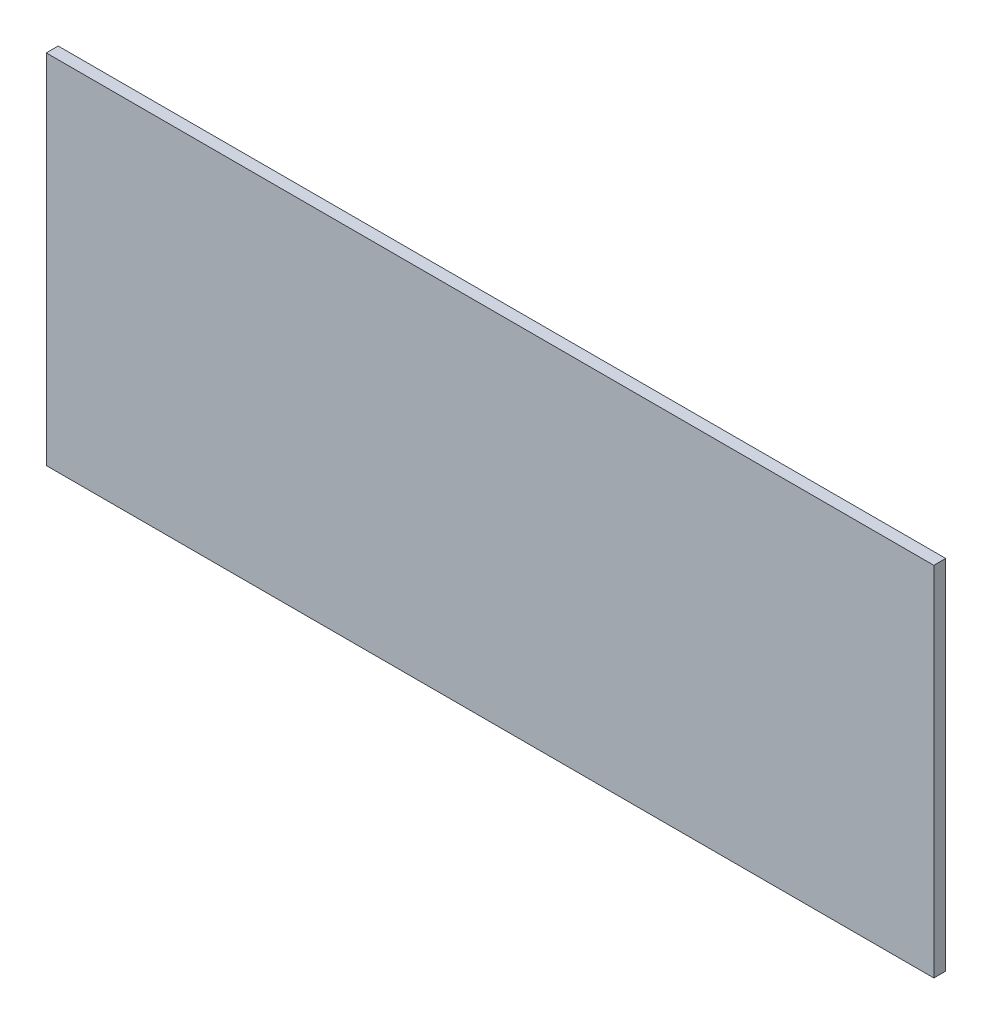
ISO-10303-21;
HEADER;
FILE_DESCRIPTION(('STEP AP214'),'2;1');
FILE_NAME('part.step','',(''),(''),'','','');
FILE_SCHEMA(('AUTOMOTIVE_DESIGN { 1 0 10303 214 1 1 1 1 }'));
ENDSEC;
DATA;
#1=APPLICATION_CONTEXT('core data for automotive mechanical design processes');
#2=APPLICATION_PROTOCOL_DEFINITION('international standard','automotive_design',2000,#1);
#3=PRODUCT_CONTEXT('',#1,'mechanical');
#4=PRODUCT('Part','Part','',(#3));
#5=PRODUCT_RELATED_PRODUCT_CATEGORY('part','',(#4));
#6=PRODUCT_DEFINITION_FORMATION('','',#4);
#7=PRODUCT_DEFINITION_CONTEXT('part definition',#1,'design');
#8=PRODUCT_DEFINITION('design','',#6,#7);
#9=PRODUCT_DEFINITION_SHAPE('','',#8);
#10=(LENGTH_UNIT() NAMED_UNIT(*) SI_UNIT(.MILLI.,.METRE.));
#11=(NAMED_UNIT(*) PLANE_ANGLE_UNIT() SI_UNIT($,.RADIAN.));
#12=(NAMED_UNIT(*) SI_UNIT($,.STERADIAN.) SOLID_ANGLE_UNIT());
#13=UNCERTAINTY_MEASURE_WITH_UNIT(LENGTH_MEASURE(1.E-05),#10,'distance_accuracy_value','');
#14=(GEOMETRIC_REPRESENTATION_CONTEXT(3) GLOBAL_UNCERTAINTY_ASSIGNED_CONTEXT((#13)) GLOBAL_UNIT_ASSIGNED_CONTEXT((#10,
#11,#12)) REPRESENTATION_CONTEXT('',''));
#15=CARTESIAN_POINT('',(0.,0.,0.));
#16=DIRECTION('',(0.,0.,1.));
#17=DIRECTION('',(1.,0.,0.));
#18=AXIS2_PLACEMENT_3D('',#15,#16,#17);
#19=CARTESIAN_POINT('',(74.5,-30.,2.));
#20=DIRECTION('',(-1.,0.,0.));
#21=DIRECTION('',(0.,0.,1.));
#22=AXIS2_PLACEMENT_3D('',#19,#20,#21);
#23=PLANE('',#22);
#24=DIRECTION('',(0.,1.,0.));
#25=VECTOR('',#24,1.);
#26=CARTESIAN_POINT('',(74.5,-30.,0.));
#27=LINE('',#26,#25);
#28=CARTESIAN_POINT('',(74.5,-30.,0.));
#29=VERTEX_POINT('',#28);
#30=CARTESIAN_POINT('',(74.5,30.,0.));
#31=VERTEX_POINT('',#30);
#32=EDGE_CURVE('E96',#29,#31,#27,.T.);
#33=ORIENTED_EDGE('',*,*,#32,.T.);
#34=DIRECTION('',(0.,0.,-1.));
#35=VECTOR('',#34,1.);
#36=CARTESIAN_POINT('',(74.5,30.,2.));
#37=LINE('',#36,#35);
#38=CARTESIAN_POINT('',(74.5,30.,2.));
#39=VERTEX_POINT('',#38);
#40=EDGE_CURVE('E11',#39,#31,#37,.T.);
#41=ORIENTED_EDGE('',*,*,#40,.F.);
#42=DIRECTION('',(0.,1.,0.));
#43=VECTOR('',#42,1.);
#44=CARTESIAN_POINT('',(74.5,-30.,2.));
#45=LINE('',#44,#43);
#46=CARTESIAN_POINT('',(74.5,-30.,2.));
#47=VERTEX_POINT('',#46);
#48=EDGE_CURVE('E84',#47,#39,#45,.T.);
#49=ORIENTED_EDGE('',*,*,#48,.F.);
#50=DIRECTION('',(0.,0.,-1.));
#51=VECTOR('',#50,1.);
#52=CARTESIAN_POINT('',(74.5,-30.,2.));
#53=LINE('',#52,#51);
#54=EDGE_CURVE('E92',#47,#29,#53,.T.);
#55=ORIENTED_EDGE('',*,*,#54,.T.);
#56=EDGE_LOOP('',(#33,#41,#49,#55));
#57=FACE_BOUND('',#56,.T.);
#58=ADVANCED_FACE('F33',(#57),#23,.F.);
#59=CARTESIAN_POINT('',(-74.5,30.,2.));
#60=DIRECTION('',(0.,-1.,0.));
#61=DIRECTION('',(0.,0.,-1.));
#62=AXIS2_PLACEMENT_3D('',#59,#60,#61);
#63=PLANE('',#62);
#64=DIRECTION('',(-1.,0.,0.));
#65=VECTOR('',#64,1.);
#66=CARTESIAN_POINT('',(-74.5,30.,0.));
#67=LINE('',#66,#65);
#68=CARTESIAN_POINT('',(-74.5,30.,0.));
#69=VERTEX_POINT('',#68);
#70=EDGE_CURVE('E88',#31,#69,#67,.T.);
#71=ORIENTED_EDGE('',*,*,#70,.T.);
#72=DIRECTION('',(0.,0.,-1.));
#73=VECTOR('',#72,1.);
#74=CARTESIAN_POINT('',(-74.5,30.,2.));
#75=LINE('',#74,#73);
#76=CARTESIAN_POINT('',(-74.5,30.,2.));
#77=VERTEX_POINT('',#76);
#78=EDGE_CURVE('E41',#77,#69,#75,.T.);
#79=ORIENTED_EDGE('',*,*,#78,.F.);
#80=DIRECTION('',(-1.,0.,0.));
#81=VECTOR('',#80,1.);
#82=CARTESIAN_POINT('',(-74.5,30.,2.));
#83=LINE('',#82,#81);
#84=EDGE_CURVE('E79',#39,#77,#83,.T.);
#85=ORIENTED_EDGE('',*,*,#84,.F.);
#86=ORIENTED_EDGE('',*,*,#40,.T.);
#87=EDGE_LOOP('',(#71,#79,#85,#86));
#88=FACE_BOUND('',#87,.T.);
#89=ADVANCED_FACE('F87',(#88),#63,.F.);
#90=CARTESIAN_POINT('',(-74.5,-30.,2.));
#91=DIRECTION('',(1.,0.,0.));
#92=DIRECTION('',(0.,0.,-1.));
#93=AXIS2_PLACEMENT_3D('',#90,#91,#92);
#94=PLANE('',#93);
#95=DIRECTION('',(0.,-1.,0.));
#96=VECTOR('',#95,1.);
#97=CARTESIAN_POINT('',(-74.5,-30.,0.));
#98=LINE('',#97,#96);
#99=CARTESIAN_POINT('',(-74.5,-30.,0.));
#100=VERTEX_POINT('',#99);
#101=EDGE_CURVE('E66',#69,#100,#98,.T.);
#102=ORIENTED_EDGE('',*,*,#101,.T.);
#103=DIRECTION('',(0.,0.,-1.));
#104=VECTOR('',#103,1.);
#105=CARTESIAN_POINT('',(-74.5,-30.,2.));
#106=LINE('',#105,#104);
#107=CARTESIAN_POINT('',(-74.5,-30.,2.));
#108=VERTEX_POINT('',#107);
#109=EDGE_CURVE('E89',#108,#100,#106,.T.);
#110=ORIENTED_EDGE('',*,*,#109,.F.);
#111=DIRECTION('',(0.,-1.,0.));
#112=VECTOR('',#111,1.);
#113=CARTESIAN_POINT('',(-74.5,-30.,2.));
#114=LINE('',#113,#112);
#115=EDGE_CURVE('E82',#77,#108,#114,.T.);
#116=ORIENTED_EDGE('',*,*,#115,.F.);
#117=ORIENTED_EDGE('',*,*,#78,.T.);
#118=EDGE_LOOP('',(#102,#110,#116,#117));
#119=FACE_BOUND('',#118,.T.);
#120=ADVANCED_FACE('F90',(#119),#94,.F.);
#121=CARTESIAN_POINT('',(-74.5,-30.,2.));
#122=DIRECTION('',(0.,1.,0.));
#123=DIRECTION('',(0.,0.,1.));
#124=AXIS2_PLACEMENT_3D('',#121,#122,#123);
#125=PLANE('',#124);
#126=DIRECTION('',(1.,0.,0.));
#127=VECTOR('',#126,1.);
#128=CARTESIAN_POINT('',(-74.5,-30.,0.));
#129=LINE('',#128,#127);
#130=EDGE_CURVE('E72',#100,#29,#129,.T.);
#131=ORIENTED_EDGE('',*,*,#130,.T.);
#132=ORIENTED_EDGE('',*,*,#54,.F.);
#133=DIRECTION('',(1.,0.,0.));
#134=VECTOR('',#133,1.);
#135=CARTESIAN_POINT('',(-74.5,-30.,2.));
#136=LINE('',#135,#134);
#137=EDGE_CURVE('E49',#108,#47,#136,.T.);
#138=ORIENTED_EDGE('',*,*,#137,.F.);
#139=ORIENTED_EDGE('',*,*,#109,.T.);
#140=EDGE_LOOP('',(#131,#132,#138,#139));
#141=FACE_BOUND('',#140,.T.);
#142=ADVANCED_FACE('F103',(#141),#125,.F.);
#143=CARTESIAN_POINT('',(0.,0.,2.));
#144=DIRECTION('',(0.,0.,-1.));
#145=DIRECTION('',(-1.,0.,0.));
#146=AXIS2_PLACEMENT_3D('',#143,#144,#145);
#147=PLANE('',#146);
#148=ORIENTED_EDGE('',*,*,#48,.T.);
#149=ORIENTED_EDGE('',*,*,#84,.T.);
#150=ORIENTED_EDGE('',*,*,#115,.T.);
#151=ORIENTED_EDGE('',*,*,#137,.T.);
#152=EDGE_LOOP('',(#148,#149,#150,#151));
#153=FACE_BOUND('',#152,.T.);
#154=ADVANCED_FACE('F80',(#153),#147,.F.);
#155=CARTESIAN_POINT('',(0.,0.,0.));
#156=DIRECTION('',(0.,0.,-1.));
#157=DIRECTION('',(-1.,0.,0.));
#158=AXIS2_PLACEMENT_3D('',#155,#156,#157);
#159=PLANE('',#158);
#160=ORIENTED_EDGE('',*,*,#32,.F.);
#161=ORIENTED_EDGE('',*,*,#130,.F.);
#162=ORIENTED_EDGE('',*,*,#101,.F.);
#163=ORIENTED_EDGE('',*,*,#70,.F.);
#164=EDGE_LOOP('',(#160,#161,#162,#163));
#165=FACE_BOUND('',#164,.T.);
#166=ADVANCED_FACE('F106',(#165),#159,.T.);
#167=CLOSED_SHELL('',(#58,#89,#120,#142,#154,#166));
#168=MANIFOLD_SOLID_BREP('B2',#167);
#169=ADVANCED_BREP_SHAPE_REPRESENTATION('',(#18,#168),#14);
#170=SHAPE_DEFINITION_REPRESENTATION(#9,#169);
ENDSEC;
END-ISO-10303-21;
